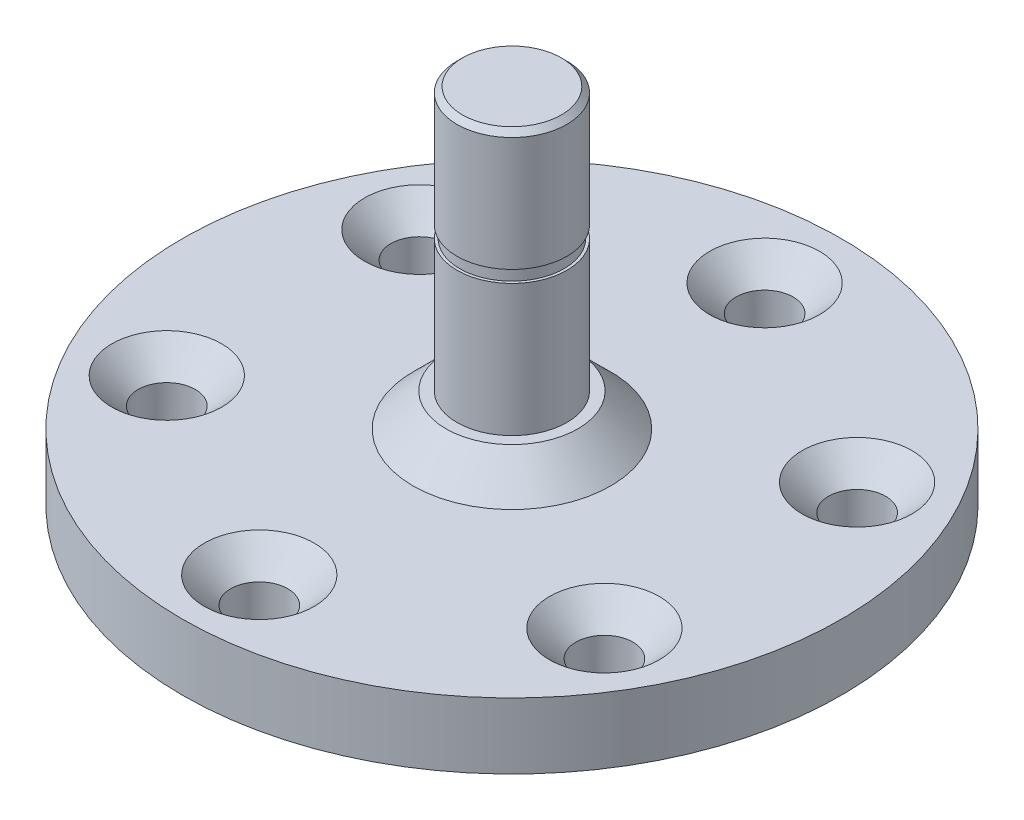
ISO-10303-21;
HEADER;
FILE_DESCRIPTION(('STEP AP214'),'2;1');
FILE_NAME('part.step','',(''),(''),'','','');
FILE_SCHEMA(('AUTOMOTIVE_DESIGN { 1 0 10303 214 1 1 1 1 }'));
ENDSEC;
DATA;
#1=APPLICATION_CONTEXT('core data for automotive mechanical design processes');
#2=APPLICATION_PROTOCOL_DEFINITION('international standard','automotive_design',2000,#1);
#3=PRODUCT_CONTEXT('',#1,'mechanical');
#4=PRODUCT('Part','Part','',(#3));
#5=PRODUCT_RELATED_PRODUCT_CATEGORY('part','',(#4));
#6=PRODUCT_DEFINITION_FORMATION('','',#4);
#7=PRODUCT_DEFINITION_CONTEXT('part definition',#1,'design');
#8=PRODUCT_DEFINITION('design','',#6,#7);
#9=PRODUCT_DEFINITION_SHAPE('','',#8);
#10=(LENGTH_UNIT() NAMED_UNIT(*) SI_UNIT(.MILLI.,.METRE.));
#11=(NAMED_UNIT(*) PLANE_ANGLE_UNIT() SI_UNIT($,.RADIAN.));
#12=(NAMED_UNIT(*) SI_UNIT($,.STERADIAN.) SOLID_ANGLE_UNIT());
#13=UNCERTAINTY_MEASURE_WITH_UNIT(LENGTH_MEASURE(1.E-05),#10,'distance_accuracy_value','');
#14=(GEOMETRIC_REPRESENTATION_CONTEXT(3) GLOBAL_UNCERTAINTY_ASSIGNED_CONTEXT((#13)) GLOBAL_UNIT_ASSIGNED_CONTEXT((#10,
#11,#12)) REPRESENTATION_CONTEXT('',''));
#15=CARTESIAN_POINT('',(0.,0.,0.));
#16=DIRECTION('',(0.,0.,1.));
#17=DIRECTION('',(1.,0.,0.));
#18=AXIS2_PLACEMENT_3D('',#15,#16,#17);
#19=CARTESIAN_POINT('',(0.,33.,0.));
#20=DIRECTION('',(0.,-1.,0.));
#21=DIRECTION('',(0.,0.,-1.));
#22=AXIS2_PLACEMENT_3D('',#19,#20,#21);
#23=CYLINDRICAL_SURFACE('',#22,5.);
#24=CARTESIAN_POINT('',(0.,9.,0.));
#25=DIRECTION('',(0.,1.,0.));
#26=DIRECTION('',(0.,0.,1.));
#27=AXIS2_PLACEMENT_3D('',#24,#25,#26);
#28=CIRCLE('',#27,5.);
#29=CARTESIAN_POINT('',(0.,9.,5.));
#30=VERTEX_POINT('',#29);
#31=EDGE_CURVE('E119',#30,#30,#28,.T.);
#32=ORIENTED_EDGE('',*,*,#31,.T.);
#33=EDGE_LOOP('',(#32));
#34=FACE_BOUND('',#33,.T.);
#35=CARTESIAN_POINT('',(0.,21.,0.));
#36=DIRECTION('',(0.,1.,0.));
#37=DIRECTION('',(0.,0.,1.));
#38=AXIS2_PLACEMENT_3D('',#35,#36,#37);
#39=CIRCLE('',#38,5.);
#40=CARTESIAN_POINT('',(0.,21.,5.));
#41=VERTEX_POINT('',#40);
#42=EDGE_CURVE('E116',#41,#41,#39,.T.);
#43=ORIENTED_EDGE('',*,*,#42,.F.);
#44=EDGE_LOOP('',(#43));
#45=FACE_BOUND('',#44,.T.);
#46=ADVANCED_FACE('F35',(#34,#45),#23,.T.);
#47=CARTESIAN_POINT('',(0.,6.,0.));
#48=DIRECTION('',(0.,-1.,0.));
#49=DIRECTION('',(0.,0.,-1.));
#50=AXIS2_PLACEMENT_3D('',#47,#48,#49);
#51=CYLINDRICAL_SURFACE('',#50,30.);
#52=CARTESIAN_POINT('',(0.,6.,0.));
#53=DIRECTION('',(0.,1.,0.));
#54=DIRECTION('',(0.,0.,1.));
#55=AXIS2_PLACEMENT_3D('',#52,#53,#54);
#56=CIRCLE('',#55,30.);
#57=CARTESIAN_POINT('',(0.,6.,30.));
#58=VERTEX_POINT('',#57);
#59=EDGE_CURVE('E127',#58,#58,#56,.T.);
#60=ORIENTED_EDGE('',*,*,#59,.F.);
#61=EDGE_LOOP('',(#60));
#62=FACE_BOUND('',#61,.T.);
#63=CARTESIAN_POINT('',(0.,0.,0.));
#64=DIRECTION('',(0.,1.,0.));
#65=DIRECTION('',(0.,0.,1.));
#66=AXIS2_PLACEMENT_3D('',#63,#64,#65);
#67=CIRCLE('',#66,30.);
#68=CARTESIAN_POINT('',(0.,0.,30.));
#69=VERTEX_POINT('',#68);
#70=EDGE_CURVE('E126',#69,#69,#67,.T.);
#71=ORIENTED_EDGE('',*,*,#70,.T.);
#72=EDGE_LOOP('',(#71));
#73=FACE_BOUND('',#72,.T.);
#74=ADVANCED_FACE('F166',(#62,#73),#51,.T.);
#75=CARTESIAN_POINT('',(0.,6.,0.));
#76=DIRECTION('',(0.,1.,0.));
#77=DIRECTION('',(0.,0.,1.));
#78=AXIS2_PLACEMENT_3D('',#75,#76,#77);
#79=PLANE('',#78);
#80=CARTESIAN_POINT('',(19.918584287042,6.,11.5000000000002));
#81=DIRECTION('',(0.,1.,0.));
#82=DIRECTION('',(0.866025403784433,0.,0.50000000000001));
#83=AXIS2_PLACEMENT_3D('',#80,#81,#82);
#84=CIRCLE('',#83,5.);
#85=CARTESIAN_POINT('',(24.2487113059641,6.,14.0000000000003));
#86=VERTEX_POINT('',#85);
#87=EDGE_CURVE('E80',#86,#86,#84,.T.);
#88=ORIENTED_EDGE('',*,*,#87,.F.);
#89=EDGE_LOOP('',(#88));
#90=FACE_BOUND('',#89,.T.);
#91=CARTESIAN_POINT('',(19.9185842870422,6.,-11.4999999999998));
#92=DIRECTION('',(0.,1.,0.));
#93=DIRECTION('',(0.866025403784443,0.,-0.499999999999992));
#94=AXIS2_PLACEMENT_3D('',#91,#92,#93);
#95=CIRCLE('',#94,5.);
#96=CARTESIAN_POINT('',(24.2487113059644,6.,-13.9999999999998));
#97=VERTEX_POINT('',#96);
#98=EDGE_CURVE('E70',#97,#97,#95,.T.);
#99=ORIENTED_EDGE('',*,*,#98,.F.);
#100=EDGE_LOOP('',(#99));
#101=FACE_BOUND('',#100,.T.);
#102=CARTESIAN_POINT('',(0.,6.,-23.));
#103=DIRECTION('',(0.,1.,0.));
#104=DIRECTION('',(0.,0.,-1.));
#105=AXIS2_PLACEMENT_3D('',#102,#103,#104);
#106=CIRCLE('',#105,5.);
#107=CARTESIAN_POINT('',(0.,6.,-28.));
#108=VERTEX_POINT('',#107);
#109=EDGE_CURVE('E67',#108,#108,#106,.T.);
#110=ORIENTED_EDGE('',*,*,#109,.F.);
#111=EDGE_LOOP('',(#110));
#112=FACE_BOUND('',#111,.T.);
#113=CARTESIAN_POINT('',(-19.918584287042,6.,-11.5000000000001));
#114=DIRECTION('',(0.,1.,0.));
#115=DIRECTION('',(-0.866025403784436,0.,-0.500000000000004));
#116=AXIS2_PLACEMENT_3D('',#113,#114,#115);
#117=CIRCLE('',#116,5.);
#118=CARTESIAN_POINT('',(-24.2487113059642,6.,-14.0000000000001));
#119=VERTEX_POINT('',#118);
#120=EDGE_CURVE('E64',#119,#119,#117,.T.);
#121=ORIENTED_EDGE('',*,*,#120,.F.);
#122=EDGE_LOOP('',(#121));
#123=FACE_BOUND('',#122,.T.);
#124=CARTESIAN_POINT('',(-19.9185842870421,6.,11.5));
#125=DIRECTION('',(0.,1.,0.));
#126=DIRECTION('',(-0.86602540378444,0.,0.499999999999998));
#127=AXIS2_PLACEMENT_3D('',#124,#125,#126);
#128=CIRCLE('',#127,5.);
#129=CARTESIAN_POINT('',(-24.2487113059643,6.,13.9999999999999));
#130=VERTEX_POINT('',#129);
#131=EDGE_CURVE('E60',#130,#130,#128,.T.);
#132=ORIENTED_EDGE('',*,*,#131,.F.);
#133=EDGE_LOOP('',(#132));
#134=FACE_BOUND('',#133,.T.);
#135=CARTESIAN_POINT('',(0.,6.,23.));
#136=DIRECTION('',(0.,1.,0.));
#137=DIRECTION('',(0.,0.,1.));
#138=AXIS2_PLACEMENT_3D('',#135,#136,#137);
#139=CIRCLE('',#138,5.);
#140=CARTESIAN_POINT('',(0.,6.,28.));
#141=VERTEX_POINT('',#140);
#142=EDGE_CURVE('E56',#141,#141,#139,.T.);
#143=ORIENTED_EDGE('',*,*,#142,.F.);
#144=EDGE_LOOP('',(#143));
#145=FACE_BOUND('',#144,.T.);
#146=CARTESIAN_POINT('',(0.,6.,0.));
#147=DIRECTION('',(0.,1.,0.));
#148=DIRECTION('',(0.,0.,1.));
#149=AXIS2_PLACEMENT_3D('',#146,#147,#148);
#150=CIRCLE('',#149,8.99999999999997);
#151=CARTESIAN_POINT('',(0.,6.,8.99999999999997));
#152=VERTEX_POINT('',#151);
#153=EDGE_CURVE('E48',#152,#152,#150,.F.);
#154=ORIENTED_EDGE('',*,*,#153,.T.);
#155=EDGE_LOOP('',(#154));
#156=FACE_BOUND('',#155,.T.);
#157=ORIENTED_EDGE('',*,*,#59,.T.);
#158=EDGE_LOOP('',(#157));
#159=FACE_BOUND('',#158,.T.);
#160=ADVANCED_FACE('F138',(#90,#101,#112,#123,#134,#145,#156,#159),#79,.T.);
#161=CARTESIAN_POINT('',(0.,0.,0.));
#162=DIRECTION('',(0.,1.,0.));
#163=DIRECTION('',(0.,0.,1.));
#164=AXIS2_PLACEMENT_3D('',#161,#162,#163);
#165=PLANE('',#164);
#166=CARTESIAN_POINT('',(0.,0.,0.));
#167=DIRECTION('',(0.,-1.,0.));
#168=DIRECTION('',(0.,0.,-1.));
#169=AXIS2_PLACEMENT_3D('',#166,#167,#168);
#170=CIRCLE('',#169,13.);
#171=CARTESIAN_POINT('',(0.,0.,-13.));
#172=VERTEX_POINT('',#171);
#173=EDGE_CURVE('E55',#172,#172,#170,.T.);
#174=ORIENTED_EDGE('',*,*,#173,.F.);
#175=EDGE_LOOP('',(#174));
#176=FACE_BOUND('',#175,.T.);
#177=CARTESIAN_POINT('',(-19.9185842870421,0.,-11.5));
#178=DIRECTION('',(0.,1.,0.));
#179=DIRECTION('',(0.,0.,1.));
#180=AXIS2_PLACEMENT_3D('',#177,#178,#179);
#181=CIRCLE('',#180,2.6);
#182=CARTESIAN_POINT('',(-19.9185842870421,0.,-8.89999999999998));
#183=VERTEX_POINT('',#182);
#184=EDGE_CURVE('E92',#183,#183,#181,.T.);
#185=ORIENTED_EDGE('',*,*,#184,.T.);
#186=EDGE_LOOP('',(#185));
#187=FACE_BOUND('',#186,.T.);
#188=CARTESIAN_POINT('',(-19.9185842870421,0.,11.5));
#189=DIRECTION('',(0.,1.,0.));
#190=DIRECTION('',(0.,0.,1.));
#191=AXIS2_PLACEMENT_3D('',#188,#189,#190);
#192=CIRCLE('',#191,2.6);
#193=CARTESIAN_POINT('',(-19.9185842870421,0.,14.1));
#194=VERTEX_POINT('',#193);
#195=EDGE_CURVE('E97',#194,#194,#192,.T.);
#196=ORIENTED_EDGE('',*,*,#195,.T.);
#197=EDGE_LOOP('',(#196));
#198=FACE_BOUND('',#197,.T.);
#199=CARTESIAN_POINT('',(0.,0.,23.));
#200=DIRECTION('',(0.,1.,0.));
#201=DIRECTION('',(0.,0.,1.));
#202=AXIS2_PLACEMENT_3D('',#199,#200,#201);
#203=CIRCLE('',#202,2.6);
#204=CARTESIAN_POINT('',(0.,0.,25.6));
#205=VERTEX_POINT('',#204);
#206=EDGE_CURVE('E100',#205,#205,#203,.T.);
#207=ORIENTED_EDGE('',*,*,#206,.T.);
#208=EDGE_LOOP('',(#207));
#209=FACE_BOUND('',#208,.T.);
#210=CARTESIAN_POINT('',(19.9185842870421,0.,11.5));
#211=DIRECTION('',(0.,1.,0.));
#212=DIRECTION('',(0.,0.,1.));
#213=AXIS2_PLACEMENT_3D('',#210,#211,#212);
#214=CIRCLE('',#213,2.6);
#215=CARTESIAN_POINT('',(19.9185842870421,0.,14.1));
#216=VERTEX_POINT('',#215);
#217=EDGE_CURVE('E103',#216,#216,#214,.T.);
#218=ORIENTED_EDGE('',*,*,#217,.T.);
#219=EDGE_LOOP('',(#218));
#220=FACE_BOUND('',#219,.T.);
#221=CARTESIAN_POINT('',(19.9185842870421,0.,-11.5));
#222=DIRECTION('',(0.,1.,0.));
#223=DIRECTION('',(0.,0.,1.));
#224=AXIS2_PLACEMENT_3D('',#221,#222,#223);
#225=CIRCLE('',#224,2.6);
#226=CARTESIAN_POINT('',(19.9185842870421,0.,-8.90000000000001));
#227=VERTEX_POINT('',#226);
#228=EDGE_CURVE('E106',#227,#227,#225,.T.);
#229=ORIENTED_EDGE('',*,*,#228,.T.);
#230=EDGE_LOOP('',(#229));
#231=FACE_BOUND('',#230,.T.);
#232=CARTESIAN_POINT('',(0.,0.,-23.));
#233=DIRECTION('',(0.,1.,0.));
#234=DIRECTION('',(0.,0.,1.));
#235=AXIS2_PLACEMENT_3D('',#232,#233,#234);
#236=CIRCLE('',#235,2.6);
#237=CARTESIAN_POINT('',(0.,0.,-20.4));
#238=VERTEX_POINT('',#237);
#239=EDGE_CURVE('E109',#238,#238,#236,.T.);
#240=ORIENTED_EDGE('',*,*,#239,.T.);
#241=EDGE_LOOP('',(#240));
#242=FACE_BOUND('',#241,.T.);
#243=ORIENTED_EDGE('',*,*,#70,.F.);
#244=EDGE_LOOP('',(#243));
#245=FACE_BOUND('',#244,.T.);
#246=ADVANCED_FACE('F150',(#176,#187,#198,#209,#220,#231,#242,#245),#165,.F.);
#247=CARTESIAN_POINT('',(0.,9.,0.));
#248=DIRECTION('',(0.,1.,0.));
#249=DIRECTION('',(0.,0.,1.));
#250=AXIS2_PLACEMENT_3D('',#247,#248,#249);
#251=PLANE('',#250);
#252=ORIENTED_EDGE('',*,*,#31,.F.);
#253=EDGE_LOOP('',(#252));
#254=FACE_BOUND('',#253,.T.);
#255=CARTESIAN_POINT('',(0.,9.,0.));
#256=DIRECTION('',(0.,1.,0.));
#257=DIRECTION('',(0.,0.,1.));
#258=AXIS2_PLACEMENT_3D('',#255,#256,#257);
#259=CIRCLE('',#258,6.);
#260=CARTESIAN_POINT('',(0.,9.,6.));
#261=VERTEX_POINT('',#260);
#262=EDGE_CURVE('E122',#261,#261,#259,.T.);
#263=ORIENTED_EDGE('',*,*,#262,.T.);
#264=EDGE_LOOP('',(#263));
#265=FACE_BOUND('',#264,.T.);
#266=ADVANCED_FACE('F147',(#254,#265),#251,.T.);
#267=CARTESIAN_POINT('',(0.,22.1,0.));
#268=DIRECTION('',(0.,1.,0.));
#269=DIRECTION('',(0.,0.,1.));
#270=AXIS2_PLACEMENT_3D('',#267,#268,#269);
#271=PLANE('',#270);
#272=CARTESIAN_POINT('',(0.,22.1,0.));
#273=DIRECTION('',(0.,1.,0.));
#274=DIRECTION('',(0.,0.,1.));
#275=AXIS2_PLACEMENT_3D('',#272,#273,#274);
#276=CIRCLE('',#275,4.75);
#277=CARTESIAN_POINT('',(0.,22.1,4.75));
#278=VERTEX_POINT('',#277);
#279=EDGE_CURVE('E113',#278,#278,#276,.T.);
#280=ORIENTED_EDGE('',*,*,#279,.T.);
#281=EDGE_LOOP('',(#280));
#282=FACE_BOUND('',#281,.T.);
#283=CARTESIAN_POINT('',(0.,22.1,0.));
#284=DIRECTION('',(0.,1.,0.));
#285=DIRECTION('',(0.,0.,1.));
#286=AXIS2_PLACEMENT_3D('',#283,#284,#285);
#287=CIRCLE('',#286,5.);
#288=CARTESIAN_POINT('',(0.,22.1,5.));
#289=VERTEX_POINT('',#288);
#290=EDGE_CURVE('E123',#289,#289,#287,.T.);
#291=ORIENTED_EDGE('',*,*,#290,.F.);
#292=EDGE_LOOP('',(#291));
#293=FACE_BOUND('',#292,.T.);
#294=ADVANCED_FACE('F149',(#282,#293),#271,.F.);
#295=CARTESIAN_POINT('',(0.,21.,0.));
#296=DIRECTION('',(0.,1.,0.));
#297=DIRECTION('',(0.,0.,1.));
#298=AXIS2_PLACEMENT_3D('',#295,#296,#297);
#299=PLANE('',#298);
#300=CARTESIAN_POINT('',(0.,21.,0.));
#301=DIRECTION('',(0.,1.,0.));
#302=DIRECTION('',(0.,0.,1.));
#303=AXIS2_PLACEMENT_3D('',#300,#301,#302);
#304=CIRCLE('',#303,4.75);
#305=CARTESIAN_POINT('',(0.,21.,4.75));
#306=VERTEX_POINT('',#305);
#307=EDGE_CURVE('E112',#306,#306,#304,.T.);
#308=ORIENTED_EDGE('',*,*,#307,.F.);
#309=EDGE_LOOP('',(#308));
#310=FACE_BOUND('',#309,.T.);
#311=ORIENTED_EDGE('',*,*,#42,.T.);
#312=EDGE_LOOP('',(#311));
#313=FACE_BOUND('',#312,.T.);
#314=ADVANCED_FACE('F157',(#310,#313),#299,.T.);
#315=CARTESIAN_POINT('',(0.,22.1,0.));
#316=DIRECTION('',(0.,-1.,0.));
#317=DIRECTION('',(0.,0.,-1.));
#318=AXIS2_PLACEMENT_3D('',#315,#316,#317);
#319=CYLINDRICAL_SURFACE('',#318,4.75);
#320=ORIENTED_EDGE('',*,*,#279,.F.);
#321=EDGE_LOOP('',(#320));
#322=FACE_BOUND('',#321,.T.);
#323=ORIENTED_EDGE('',*,*,#307,.T.);
#324=EDGE_LOOP('',(#323));
#325=FACE_BOUND('',#324,.T.);
#326=ADVANCED_FACE('F186',(#322,#325),#319,.T.);
#327=CARTESIAN_POINT('',(0.,33.,0.));
#328=DIRECTION('',(0.,1.,0.));
#329=DIRECTION('',(0.,0.,1.));
#330=AXIS2_PLACEMENT_3D('',#327,#328,#329);
#331=PLANE('',#330);
#332=CARTESIAN_POINT('',(0.,33.,0.));
#333=DIRECTION('',(0.,1.,0.));
#334=DIRECTION('',(0.,0.,1.));
#335=AXIS2_PLACEMENT_3D('',#332,#333,#334);
#336=CIRCLE('',#335,4.5);
#337=CARTESIAN_POINT('',(0.,33.,4.5));
#338=VERTEX_POINT('',#337);
#339=EDGE_CURVE('E43',#338,#338,#336,.T.);
#340=ORIENTED_EDGE('',*,*,#339,.T.);
#341=EDGE_LOOP('',(#340));
#342=FACE_BOUND('',#341,.T.);
#343=ADVANCED_FACE('F178',(#342),#331,.T.);
#344=CARTESIAN_POINT('',(0.,32.5,0.));
#345=DIRECTION('',(0.,1.,0.));
#346=DIRECTION('',(0.,0.,1.));
#347=AXIS2_PLACEMENT_3D('',#344,#345,#346);
#348=CIRCLE('',#347,5.);
#349=CARTESIAN_POINT('',(0.,32.5,5.));
#350=VERTEX_POINT('',#349);
#351=EDGE_CURVE('E11',#350,#350,#348,.F.);
#352=ORIENTED_EDGE('',*,*,#351,.T.);
#353=EDGE_LOOP('',(#352));
#354=FACE_BOUND('',#353,.T.);
#355=ORIENTED_EDGE('',*,*,#290,.T.);
#356=EDGE_LOOP('',(#355));
#357=FACE_BOUND('',#356,.T.);
#358=ADVANCED_FACE('F168',(#354,#357),#23,.T.);
#359=CARTESIAN_POINT('',(0.,0.,-23.));
#360=DIRECTION('',(0.,1.,0.));
#361=DIRECTION('',(0.,0.,1.));
#362=AXIS2_PLACEMENT_3D('',#359,#360,#361);
#363=CYLINDRICAL_SURFACE('',#362,2.6);
#364=CARTESIAN_POINT('',(0.,3.59999999999998,-23.));
#365=DIRECTION('',(0.,1.,0.));
#366=DIRECTION('',(0.,0.,1.));
#367=AXIS2_PLACEMENT_3D('',#364,#365,#366);
#368=CIRCLE('',#367,2.6);
#369=CARTESIAN_POINT('',(0.,3.59999999999998,-20.4));
#370=VERTEX_POINT('',#369);
#371=EDGE_CURVE('E65',#370,#370,#368,.T.);
#372=ORIENTED_EDGE('',*,*,#371,.T.);
#373=EDGE_LOOP('',(#372));
#374=FACE_BOUND('',#373,.T.);
#375=ORIENTED_EDGE('',*,*,#239,.F.);
#376=EDGE_LOOP('',(#375));
#377=FACE_BOUND('',#376,.T.);
#378=ADVANCED_FACE('F177',(#374,#377),#363,.F.);
#379=CARTESIAN_POINT('',(19.9185842870421,0.,-11.5));
#380=DIRECTION('',(0.,1.,0.));
#381=DIRECTION('',(0.,0.,1.));
#382=AXIS2_PLACEMENT_3D('',#379,#380,#381);
#383=CYLINDRICAL_SURFACE('',#382,2.6);
#384=CARTESIAN_POINT('',(19.9185842870422,3.59999999999998,-11.4999999999998));
#385=DIRECTION('',(0.,1.,0.));
#386=DIRECTION('',(0.,0.,1.));
#387=AXIS2_PLACEMENT_3D('',#384,#385,#386);
#388=CIRCLE('',#387,2.6);
#389=CARTESIAN_POINT('',(19.9185842870422,3.59999999999998,-8.89999999999981));
#390=VERTEX_POINT('',#389);
#391=EDGE_CURVE('E68',#390,#390,#388,.T.);
#392=ORIENTED_EDGE('',*,*,#391,.T.);
#393=EDGE_LOOP('',(#392));
#394=FACE_BOUND('',#393,.T.);
#395=ORIENTED_EDGE('',*,*,#228,.F.);
#396=EDGE_LOOP('',(#395));
#397=FACE_BOUND('',#396,.T.);
#398=ADVANCED_FACE('F183',(#394,#397),#383,.F.);
#399=CARTESIAN_POINT('',(19.9185842870421,0.,11.5));
#400=DIRECTION('',(0.,1.,0.));
#401=DIRECTION('',(0.,0.,1.));
#402=AXIS2_PLACEMENT_3D('',#399,#400,#401);
#403=CYLINDRICAL_SURFACE('',#402,2.6);
#404=CARTESIAN_POINT('',(19.918584287042,3.59999999999998,11.5000000000002));
#405=DIRECTION('',(0.,1.,0.));
#406=DIRECTION('',(0.,0.,1.));
#407=AXIS2_PLACEMENT_3D('',#404,#405,#406);
#408=CIRCLE('',#407,2.6);
#409=CARTESIAN_POINT('',(19.918584287042,3.59999999999998,14.1000000000002));
#410=VERTEX_POINT('',#409);
#411=EDGE_CURVE('E39',#410,#410,#408,.T.);
#412=ORIENTED_EDGE('',*,*,#411,.T.);
#413=EDGE_LOOP('',(#412));
#414=FACE_BOUND('',#413,.T.);
#415=ORIENTED_EDGE('',*,*,#217,.F.);
#416=EDGE_LOOP('',(#415));
#417=FACE_BOUND('',#416,.T.);
#418=ADVANCED_FACE('F202',(#414,#417),#403,.F.);
#419=CARTESIAN_POINT('',(0.,0.,23.));
#420=DIRECTION('',(0.,1.,0.));
#421=DIRECTION('',(0.,0.,1.));
#422=AXIS2_PLACEMENT_3D('',#419,#420,#421);
#423=CYLINDRICAL_SURFACE('',#422,2.6);
#424=CARTESIAN_POINT('',(0.,3.59999999999998,23.));
#425=DIRECTION('',(0.,1.,0.));
#426=DIRECTION('',(0.,0.,1.));
#427=AXIS2_PLACEMENT_3D('',#424,#425,#426);
#428=CIRCLE('',#427,2.6);
#429=CARTESIAN_POINT('',(0.,3.59999999999998,25.6));
#430=VERTEX_POINT('',#429);
#431=EDGE_CURVE('E52',#430,#430,#428,.T.);
#432=ORIENTED_EDGE('',*,*,#431,.T.);
#433=EDGE_LOOP('',(#432));
#434=FACE_BOUND('',#433,.T.);
#435=ORIENTED_EDGE('',*,*,#206,.F.);
#436=EDGE_LOOP('',(#435));
#437=FACE_BOUND('',#436,.T.);
#438=ADVANCED_FACE('F205',(#434,#437),#423,.F.);
#439=CARTESIAN_POINT('',(-19.9185842870421,0.,11.5));
#440=DIRECTION('',(0.,1.,0.));
#441=DIRECTION('',(0.,0.,1.));
#442=AXIS2_PLACEMENT_3D('',#439,#440,#441);
#443=CYLINDRICAL_SURFACE('',#442,2.6);
#444=CARTESIAN_POINT('',(-19.9185842870421,3.59999999999998,11.5));
#445=DIRECTION('',(0.,1.,0.));
#446=DIRECTION('',(0.,0.,1.));
#447=AXIS2_PLACEMENT_3D('',#444,#445,#446);
#448=CIRCLE('',#447,2.6);
#449=CARTESIAN_POINT('',(-19.9185842870421,3.59999999999998,14.1));
#450=VERTEX_POINT('',#449);
#451=EDGE_CURVE('E57',#450,#450,#448,.T.);
#452=ORIENTED_EDGE('',*,*,#451,.T.);
#453=EDGE_LOOP('',(#452));
#454=FACE_BOUND('',#453,.T.);
#455=ORIENTED_EDGE('',*,*,#195,.F.);
#456=EDGE_LOOP('',(#455));
#457=FACE_BOUND('',#456,.T.);
#458=ADVANCED_FACE('F209',(#454,#457),#443,.F.);
#459=CARTESIAN_POINT('',(-19.9185842870421,0.,-11.5));
#460=DIRECTION('',(0.,1.,0.));
#461=DIRECTION('',(0.,0.,1.));
#462=AXIS2_PLACEMENT_3D('',#459,#460,#461);
#463=CYLINDRICAL_SURFACE('',#462,2.6);
#464=CARTESIAN_POINT('',(-19.918584287042,3.59999999999998,-11.5000000000001));
#465=DIRECTION('',(0.,1.,0.));
#466=DIRECTION('',(0.,0.,1.));
#467=AXIS2_PLACEMENT_3D('',#464,#465,#466);
#468=CIRCLE('',#467,2.6);
#469=CARTESIAN_POINT('',(-19.918584287042,3.59999999999998,-8.90000000000009));
#470=VERTEX_POINT('',#469);
#471=EDGE_CURVE('E61',#470,#470,#468,.T.);
#472=ORIENTED_EDGE('',*,*,#471,.T.);
#473=EDGE_LOOP('',(#472));
#474=FACE_BOUND('',#473,.T.);
#475=ORIENTED_EDGE('',*,*,#184,.F.);
#476=EDGE_LOOP('',(#475));
#477=FACE_BOUND('',#476,.T.);
#478=ADVANCED_FACE('F144',(#474,#477),#463,.F.);
#479=CARTESIAN_POINT('',(0.,9.,0.));
#480=DIRECTION('',(0.,-1.,0.));
#481=DIRECTION('',(0.,0.,-1.));
#482=AXIS2_PLACEMENT_3D('',#479,#480,#481);
#483=CONICAL_SURFACE('',#482,6.,0.785398163397442);
#484=ORIENTED_EDGE('',*,*,#153,.F.);
#485=EDGE_LOOP('',(#484));
#486=FACE_BOUND('',#485,.T.);
#487=ORIENTED_EDGE('',*,*,#262,.F.);
#488=EDGE_LOOP('',(#487));
#489=FACE_BOUND('',#488,.T.);
#490=ADVANCED_FACE('F141',(#486,#489),#483,.T.);
#491=CARTESIAN_POINT('',(0.,33.,0.));
#492=DIRECTION('',(0.,-1.,0.));
#493=DIRECTION('',(0.,0.,-1.));
#494=AXIS2_PLACEMENT_3D('',#491,#492,#493);
#495=CONICAL_SURFACE('',#494,4.5,0.785398163397458);
#496=ORIENTED_EDGE('',*,*,#351,.F.);
#497=EDGE_LOOP('',(#496));
#498=FACE_BOUND('',#497,.T.);
#499=ORIENTED_EDGE('',*,*,#339,.F.);
#500=EDGE_LOOP('',(#499));
#501=FACE_BOUND('',#500,.T.);
#502=ADVANCED_FACE('F37',(#498,#501),#495,.T.);
#503=CARTESIAN_POINT('',(0.,1.2,0.));
#504=DIRECTION('',(0.,-1.,0.));
#505=DIRECTION('',(0.,0.,-1.));
#506=AXIS2_PLACEMENT_3D('',#503,#504,#505);
#507=CYLINDRICAL_SURFACE('',#506,13.);
#508=CARTESIAN_POINT('',(0.,1.2,0.));
#509=DIRECTION('',(0.,-1.,0.));
#510=DIRECTION('',(0.,0.,-1.));
#511=AXIS2_PLACEMENT_3D('',#508,#509,#510);
#512=CIRCLE('',#511,13.);
#513=CARTESIAN_POINT('',(0.,1.2,-13.));
#514=VERTEX_POINT('',#513);
#515=EDGE_CURVE('E89',#514,#514,#512,.T.);
#516=ORIENTED_EDGE('',*,*,#515,.F.);
#517=EDGE_LOOP('',(#516));
#518=FACE_BOUND('',#517,.T.);
#519=ORIENTED_EDGE('',*,*,#173,.T.);
#520=EDGE_LOOP('',(#519));
#521=FACE_BOUND('',#520,.T.);
#522=ADVANCED_FACE('F217',(#518,#521),#507,.F.);
#523=CARTESIAN_POINT('',(0.,1.2,0.));
#524=DIRECTION('',(0.,-1.,0.));
#525=DIRECTION('',(0.,0.,-1.));
#526=AXIS2_PLACEMENT_3D('',#523,#524,#525);
#527=PLANE('',#526);
#528=ORIENTED_EDGE('',*,*,#515,.T.);
#529=EDGE_LOOP('',(#528));
#530=FACE_BOUND('',#529,.T.);
#531=ADVANCED_FACE('F220',(#530),#527,.T.);
#532=CARTESIAN_POINT('',(0.,6.,23.));
#533=DIRECTION('',(0.,1.,0.));
#534=DIRECTION('',(0.,0.,1.));
#535=AXIS2_PLACEMENT_3D('',#532,#533,#534);
#536=CONICAL_SURFACE('',#535,5.,0.785398163397444);
#537=ORIENTED_EDGE('',*,*,#142,.T.);
#538=EDGE_LOOP('',(#537));
#539=FACE_BOUND('',#538,.T.);
#540=ORIENTED_EDGE('',*,*,#431,.F.);
#541=EDGE_LOOP('',(#540));
#542=FACE_BOUND('',#541,.T.);
#543=ADVANCED_FACE('F224',(#539,#542),#536,.F.);
#544=CARTESIAN_POINT('',(-19.9185842870421,6.,11.5));
#545=DIRECTION('',(0.,1.,0.));
#546=DIRECTION('',(-0.86602540378444,0.,0.499999999999998));
#547=AXIS2_PLACEMENT_3D('',#544,#545,#546);
#548=CONICAL_SURFACE('',#547,5.,0.785398163397444);
#549=ORIENTED_EDGE('',*,*,#131,.T.);
#550=EDGE_LOOP('',(#549));
#551=FACE_BOUND('',#550,.T.);
#552=ORIENTED_EDGE('',*,*,#451,.F.);
#553=EDGE_LOOP('',(#552));
#554=FACE_BOUND('',#553,.T.);
#555=ADVANCED_FACE('F228',(#551,#554),#548,.F.);
#556=CARTESIAN_POINT('',(-19.918584287042,6.,-11.5000000000001));
#557=DIRECTION('',(0.,1.,0.));
#558=DIRECTION('',(-0.866025403784436,0.,-0.500000000000004));
#559=AXIS2_PLACEMENT_3D('',#556,#557,#558);
#560=CONICAL_SURFACE('',#559,5.,0.785398163397444);
#561=ORIENTED_EDGE('',*,*,#120,.T.);
#562=EDGE_LOOP('',(#561));
#563=FACE_BOUND('',#562,.T.);
#564=ORIENTED_EDGE('',*,*,#471,.F.);
#565=EDGE_LOOP('',(#564));
#566=FACE_BOUND('',#565,.T.);
#567=ADVANCED_FACE('F232',(#563,#566),#560,.F.);
#568=CARTESIAN_POINT('',(0.,6.,-23.));
#569=DIRECTION('',(0.,1.,0.));
#570=DIRECTION('',(0.,0.,-1.));
#571=AXIS2_PLACEMENT_3D('',#568,#569,#570);
#572=CONICAL_SURFACE('',#571,5.,0.785398163397444);
#573=ORIENTED_EDGE('',*,*,#109,.T.);
#574=EDGE_LOOP('',(#573));
#575=FACE_BOUND('',#574,.T.);
#576=ORIENTED_EDGE('',*,*,#371,.F.);
#577=EDGE_LOOP('',(#576));
#578=FACE_BOUND('',#577,.T.);
#579=ADVANCED_FACE('F236',(#575,#578),#572,.F.);
#580=CARTESIAN_POINT('',(19.9185842870422,6.,-11.4999999999998));
#581=DIRECTION('',(0.,1.,0.));
#582=DIRECTION('',(0.866025403784443,0.,-0.499999999999992));
#583=AXIS2_PLACEMENT_3D('',#580,#581,#582);
#584=CONICAL_SURFACE('',#583,5.,0.785398163397444);
#585=ORIENTED_EDGE('',*,*,#98,.T.);
#586=EDGE_LOOP('',(#585));
#587=FACE_BOUND('',#586,.T.);
#588=ORIENTED_EDGE('',*,*,#391,.F.);
#589=EDGE_LOOP('',(#588));
#590=FACE_BOUND('',#589,.T.);
#591=ADVANCED_FACE('F240',(#587,#590),#584,.F.);
#592=CARTESIAN_POINT('',(19.918584287042,6.,11.5000000000002));
#593=DIRECTION('',(0.,1.,0.));
#594=DIRECTION('',(0.866025403784433,0.,0.50000000000001));
#595=AXIS2_PLACEMENT_3D('',#592,#593,#594);
#596=CONICAL_SURFACE('',#595,5.,0.785398163397444);
#597=ORIENTED_EDGE('',*,*,#87,.T.);
#598=EDGE_LOOP('',(#597));
#599=FACE_BOUND('',#598,.T.);
#600=ORIENTED_EDGE('',*,*,#411,.F.);
#601=EDGE_LOOP('',(#600));
#602=FACE_BOUND('',#601,.T.);
#603=ADVANCED_FACE('F244',(#599,#602),#596,.F.);
#604=CLOSED_SHELL('',(#46,#74,#160,#246,#266,#294,#314,#326,#343,#358,#378,#398,#418,#438,#458,
#478,#490,#502,#522,#531,#543,#555,#567,#579,#591,#603));
#605=MANIFOLD_SOLID_BREP('B2',#604);
#606=ADVANCED_BREP_SHAPE_REPRESENTATION('',(#18,#605),#14);
#607=SHAPE_DEFINITION_REPRESENTATION(#9,#606);
ENDSEC;
END-ISO-10303-21;
